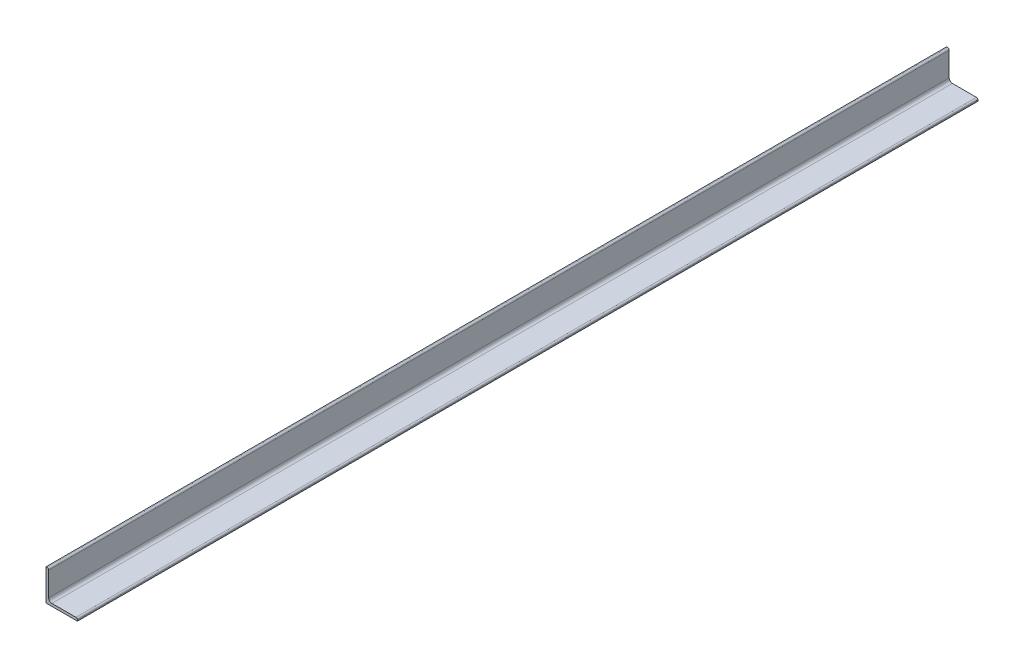
ISO-10303-21;
HEADER;
FILE_DESCRIPTION(('STEP AP214'),'2;1');
FILE_NAME('part.step','',(''),(''),'','','');
FILE_SCHEMA(('AUTOMOTIVE_DESIGN { 1 0 10303 214 1 1 1 1 }'));
ENDSEC;
DATA;
#1=APPLICATION_CONTEXT('core data for automotive mechanical design processes');
#2=APPLICATION_PROTOCOL_DEFINITION('international standard','automotive_design',2000,#1);
#3=PRODUCT_CONTEXT('',#1,'mechanical');
#4=PRODUCT('Part','Part','',(#3));
#5=PRODUCT_RELATED_PRODUCT_CATEGORY('part','',(#4));
#6=PRODUCT_DEFINITION_FORMATION('','',#4);
#7=PRODUCT_DEFINITION_CONTEXT('part definition',#1,'design');
#8=PRODUCT_DEFINITION('design','',#6,#7);
#9=PRODUCT_DEFINITION_SHAPE('','',#8);
#10=(LENGTH_UNIT() NAMED_UNIT(*) SI_UNIT(.MILLI.,.METRE.));
#11=(NAMED_UNIT(*) PLANE_ANGLE_UNIT() SI_UNIT($,.RADIAN.));
#12=(NAMED_UNIT(*) SI_UNIT($,.STERADIAN.) SOLID_ANGLE_UNIT());
#13=UNCERTAINTY_MEASURE_WITH_UNIT(LENGTH_MEASURE(1.E-05),#10,'distance_accuracy_value','');
#14=(GEOMETRIC_REPRESENTATION_CONTEXT(3) GLOBAL_UNCERTAINTY_ASSIGNED_CONTEXT((#13)) GLOBAL_UNIT_ASSIGNED_CONTEXT((#10,
#11,#12)) REPRESENTATION_CONTEXT('',''));
#15=CARTESIAN_POINT('',(0.,0.,0.));
#16=DIRECTION('',(0.,0.,1.));
#17=DIRECTION('',(1.,0.,0.));
#18=AXIS2_PLACEMENT_3D('',#15,#16,#17);
#19=CARTESIAN_POINT('',(14.224,6.35,0.));
#20=DIRECTION('',(0.,1.,0.));
#21=DIRECTION('',(0.,0.,1.));
#22=AXIS2_PLACEMENT_3D('',#19,#20,#21);
#23=PLANE('',#22);
#24=DIRECTION('',(1.,0.,0.));
#25=VECTOR('',#24,1.);
#26=CARTESIAN_POINT('',(14.224,6.35,2184.4));
#27=LINE('',#26,#25);
#28=CARTESIAN_POINT('',(14.224,6.35,2184.4));
#29=VERTEX_POINT('',#28);
#30=CARTESIAN_POINT('',(72.39,6.35000000000003,2184.4));
#31=VERTEX_POINT('',#30);
#32=EDGE_CURVE('E10',#29,#31,#27,.T.);
#33=ORIENTED_EDGE('',*,*,#32,.T.);
#34=DIRECTION('',(0.,0.,1.));
#35=VECTOR('',#34,1.);
#36=CARTESIAN_POINT('',(72.39,6.35000000000003,0.));
#37=LINE('',#36,#35);
#38=CARTESIAN_POINT('',(72.39,6.35000000000003,0.));
#39=VERTEX_POINT('',#38);
#40=EDGE_CURVE('E35',#39,#31,#37,.T.);
#41=ORIENTED_EDGE('',*,*,#40,.F.);
#42=DIRECTION('',(1.,0.,0.));
#43=VECTOR('',#42,1.);
#44=CARTESIAN_POINT('',(14.224,6.35,0.));
#45=LINE('',#44,#43);
#46=CARTESIAN_POINT('',(14.224,6.35,0.));
#47=VERTEX_POINT('',#46);
#48=EDGE_CURVE('E107',#47,#39,#45,.T.);
#49=ORIENTED_EDGE('',*,*,#48,.F.);
#50=DIRECTION('',(0.,0.,1.));
#51=VECTOR('',#50,1.);
#52=CARTESIAN_POINT('',(14.224,6.35,0.));
#53=LINE('',#52,#51);
#54=EDGE_CURVE('E26',#47,#29,#53,.T.);
#55=ORIENTED_EDGE('',*,*,#54,.T.);
#56=EDGE_LOOP('',(#33,#41,#49,#55));
#57=FACE_BOUND('',#56,.T.);
#58=ADVANCED_FACE('F16',(#57),#23,.T.);
#59=CARTESIAN_POINT('',(72.39,2.54000000000003,0.));
#60=DIRECTION('',(0.,0.,1.));
#61=DIRECTION('',(1.,0.,0.));
#62=AXIS2_PLACEMENT_3D('',#59,#60,#61);
#63=CYLINDRICAL_SURFACE('',#62,3.81);
#64=CARTESIAN_POINT('',(72.39,2.54000000000003,2184.4));
#65=DIRECTION('',(0.,0.,-1.));
#66=DIRECTION('',(0.,-1.,0.));
#67=AXIS2_PLACEMENT_3D('',#64,#65,#66);
#68=CIRCLE('',#67,3.81);
#69=CARTESIAN_POINT('',(76.2,2.54000000000003,2184.4));
#70=VERTEX_POINT('',#69);
#71=EDGE_CURVE('E115',#31,#70,#68,.T.);
#72=ORIENTED_EDGE('',*,*,#71,.T.);
#73=DIRECTION('',(0.,0.,1.));
#74=VECTOR('',#73,1.);
#75=CARTESIAN_POINT('',(76.2,2.54000000000003,0.));
#76=LINE('',#75,#74);
#77=CARTESIAN_POINT('',(76.2,2.54000000000003,0.));
#78=VERTEX_POINT('',#77);
#79=EDGE_CURVE('E117',#78,#70,#76,.T.);
#80=ORIENTED_EDGE('',*,*,#79,.F.);
#81=CARTESIAN_POINT('',(72.39,2.54000000000003,0.));
#82=DIRECTION('',(0.,0.,-1.));
#83=DIRECTION('',(0.,-1.,0.));
#84=AXIS2_PLACEMENT_3D('',#81,#82,#83);
#85=CIRCLE('',#84,3.81);
#86=EDGE_CURVE('E108',#39,#78,#85,.T.);
#87=ORIENTED_EDGE('',*,*,#86,.F.);
#88=ORIENTED_EDGE('',*,*,#40,.T.);
#89=EDGE_LOOP('',(#72,#80,#87,#88));
#90=FACE_BOUND('',#89,.T.);
#91=ADVANCED_FACE('F160',(#90),#63,.T.);
#92=CARTESIAN_POINT('',(76.2,2.54000000000003,0.));
#93=DIRECTION('',(1.,0.,0.));
#94=DIRECTION('',(0.,0.,-1.));
#95=AXIS2_PLACEMENT_3D('',#92,#93,#94);
#96=PLANE('',#95);
#97=DIRECTION('',(0.,-1.,0.));
#98=VECTOR('',#97,1.);
#99=CARTESIAN_POINT('',(76.2,2.54000000000003,2184.4));
#100=LINE('',#99,#98);
#101=CARTESIAN_POINT('',(76.2,0.,2184.4));
#102=VERTEX_POINT('',#101);
#103=EDGE_CURVE('E118',#70,#102,#100,.T.);
#104=ORIENTED_EDGE('',*,*,#103,.T.);
#105=DIRECTION('',(0.,0.,1.));
#106=VECTOR('',#105,1.);
#107=CARTESIAN_POINT('',(76.2,0.,0.));
#108=LINE('',#107,#106);
#109=CARTESIAN_POINT('',(76.2,0.,0.));
#110=VERTEX_POINT('',#109);
#111=EDGE_CURVE('E123',#110,#102,#108,.T.);
#112=ORIENTED_EDGE('',*,*,#111,.F.);
#113=DIRECTION('',(0.,-1.,0.));
#114=VECTOR('',#113,1.);
#115=CARTESIAN_POINT('',(76.2,2.54000000000003,0.));
#116=LINE('',#115,#114);
#117=EDGE_CURVE('E110',#78,#110,#116,.T.);
#118=ORIENTED_EDGE('',*,*,#117,.F.);
#119=ORIENTED_EDGE('',*,*,#79,.T.);
#120=EDGE_LOOP('',(#104,#112,#118,#119));
#121=FACE_BOUND('',#120,.T.);
#122=ADVANCED_FACE('F166',(#121),#96,.T.);
#123=CARTESIAN_POINT('',(76.2,0.,0.));
#124=DIRECTION('',(0.,-1.,0.));
#125=DIRECTION('',(0.,0.,-1.));
#126=AXIS2_PLACEMENT_3D('',#123,#124,#125);
#127=PLANE('',#126);
#128=DIRECTION('',(-1.,0.,0.));
#129=VECTOR('',#128,1.);
#130=CARTESIAN_POINT('',(76.2,0.,2184.4));
#131=LINE('',#130,#129);
#132=CARTESIAN_POINT('',(0.,0.,2184.4));
#133=VERTEX_POINT('',#132);
#134=EDGE_CURVE('E119',#102,#133,#131,.T.);
#135=ORIENTED_EDGE('',*,*,#134,.T.);
#136=DIRECTION('',(0.,0.,1.));
#137=VECTOR('',#136,1.);
#138=CARTESIAN_POINT('',(0.,0.,0.));
#139=LINE('',#138,#137);
#140=CARTESIAN_POINT('',(0.,0.,0.));
#141=VERTEX_POINT('',#140);
#142=EDGE_CURVE('E130',#141,#133,#139,.T.);
#143=ORIENTED_EDGE('',*,*,#142,.F.);
#144=DIRECTION('',(-1.,0.,0.));
#145=VECTOR('',#144,1.);
#146=CARTESIAN_POINT('',(76.2,0.,0.));
#147=LINE('',#146,#145);
#148=EDGE_CURVE('E127',#110,#141,#147,.T.);
#149=ORIENTED_EDGE('',*,*,#148,.F.);
#150=ORIENTED_EDGE('',*,*,#111,.T.);
#151=EDGE_LOOP('',(#135,#143,#149,#150));
#152=FACE_BOUND('',#151,.T.);
#153=ADVANCED_FACE('F169',(#152),#127,.T.);
#154=CARTESIAN_POINT('',(0.,0.,0.));
#155=DIRECTION('',(-1.,0.,0.));
#156=DIRECTION('',(0.,0.,1.));
#157=AXIS2_PLACEMENT_3D('',#154,#155,#156);
#158=PLANE('',#157);
#159=DIRECTION('',(0.,1.,0.));
#160=VECTOR('',#159,1.);
#161=CARTESIAN_POINT('',(0.,0.,2184.4));
#162=LINE('',#161,#160);
#163=CARTESIAN_POINT('',(0.,76.2,2184.4));
#164=VERTEX_POINT('',#163);
#165=EDGE_CURVE('E125',#133,#164,#162,.T.);
#166=ORIENTED_EDGE('',*,*,#165,.T.);
#167=DIRECTION('',(0.,0.,1.));
#168=VECTOR('',#167,1.);
#169=CARTESIAN_POINT('',(0.,76.2,0.));
#170=LINE('',#169,#168);
#171=CARTESIAN_POINT('',(0.,76.2,0.));
#172=VERTEX_POINT('',#171);
#173=EDGE_CURVE('E136',#172,#164,#170,.T.);
#174=ORIENTED_EDGE('',*,*,#173,.F.);
#175=DIRECTION('',(0.,1.,0.));
#176=VECTOR('',#175,1.);
#177=CARTESIAN_POINT('',(0.,0.,0.));
#178=LINE('',#177,#176);
#179=EDGE_CURVE('E103',#141,#172,#178,.T.);
#180=ORIENTED_EDGE('',*,*,#179,.F.);
#181=ORIENTED_EDGE('',*,*,#142,.T.);
#182=EDGE_LOOP('',(#166,#174,#180,#181));
#183=FACE_BOUND('',#182,.T.);
#184=ADVANCED_FACE('F173',(#183),#158,.T.);
#185=CARTESIAN_POINT('',(0.,76.2,0.));
#186=DIRECTION('',(0.,1.,0.));
#187=DIRECTION('',(0.,0.,1.));
#188=AXIS2_PLACEMENT_3D('',#185,#186,#187);
#189=PLANE('',#188);
#190=DIRECTION('',(1.,0.,0.));
#191=VECTOR('',#190,1.);
#192=CARTESIAN_POINT('',(0.,76.2,2184.4));
#193=LINE('',#192,#191);
#194=CARTESIAN_POINT('',(2.53999999999998,76.2,2184.4));
#195=VERTEX_POINT('',#194);
#196=EDGE_CURVE('E132',#164,#195,#193,.T.);
#197=ORIENTED_EDGE('',*,*,#196,.T.);
#198=DIRECTION('',(0.,0.,1.));
#199=VECTOR('',#198,1.);
#200=CARTESIAN_POINT('',(2.53999999999998,76.2,0.));
#201=LINE('',#200,#199);
#202=CARTESIAN_POINT('',(2.53999999999998,76.2,0.));
#203=VERTEX_POINT('',#202);
#204=EDGE_CURVE('E143',#203,#195,#201,.T.);
#205=ORIENTED_EDGE('',*,*,#204,.F.);
#206=DIRECTION('',(1.,0.,0.));
#207=VECTOR('',#206,1.);
#208=CARTESIAN_POINT('',(0.,76.2,0.));
#209=LINE('',#208,#207);
#210=EDGE_CURVE('E140',#172,#203,#209,.T.);
#211=ORIENTED_EDGE('',*,*,#210,.F.);
#212=ORIENTED_EDGE('',*,*,#173,.T.);
#213=EDGE_LOOP('',(#197,#205,#211,#212));
#214=FACE_BOUND('',#213,.T.);
#215=ADVANCED_FACE('F177',(#214),#189,.T.);
#216=CARTESIAN_POINT('',(2.53999999999998,72.39,0.));
#217=DIRECTION('',(0.,0.,1.));
#218=DIRECTION('',(1.,0.,0.));
#219=AXIS2_PLACEMENT_3D('',#216,#217,#218);
#220=CYLINDRICAL_SURFACE('',#219,3.81);
#221=CARTESIAN_POINT('',(2.53999999999998,72.39,2184.4));
#222=DIRECTION('',(0.,0.,-1.));
#223=DIRECTION('',(0.,-1.,0.));
#224=AXIS2_PLACEMENT_3D('',#221,#222,#223);
#225=CIRCLE('',#224,3.81);
#226=CARTESIAN_POINT('',(6.34999999999998,72.39,2184.4));
#227=VERTEX_POINT('',#226);
#228=EDGE_CURVE('E138',#195,#227,#225,.T.);
#229=ORIENTED_EDGE('',*,*,#228,.T.);
#230=DIRECTION('',(0.,0.,1.));
#231=VECTOR('',#230,1.);
#232=CARTESIAN_POINT('',(6.34999999999998,72.39,0.));
#233=LINE('',#232,#231);
#234=CARTESIAN_POINT('',(6.34999999999998,72.39,0.));
#235=VERTEX_POINT('',#234);
#236=EDGE_CURVE('E148',#235,#227,#233,.T.);
#237=ORIENTED_EDGE('',*,*,#236,.F.);
#238=CARTESIAN_POINT('',(2.53999999999998,72.39,0.));
#239=DIRECTION('',(0.,0.,-1.));
#240=DIRECTION('',(0.,-1.,0.));
#241=AXIS2_PLACEMENT_3D('',#238,#239,#240);
#242=CIRCLE('',#241,3.81);
#243=EDGE_CURVE('E94',#203,#235,#242,.T.);
#244=ORIENTED_EDGE('',*,*,#243,.F.);
#245=ORIENTED_EDGE('',*,*,#204,.T.);
#246=EDGE_LOOP('',(#229,#237,#244,#245));
#247=FACE_BOUND('',#246,.T.);
#248=ADVANCED_FACE('F180',(#247),#220,.T.);
#249=CARTESIAN_POINT('',(6.34999999999998,72.39,0.));
#250=DIRECTION('',(1.,0.,0.));
#251=DIRECTION('',(0.,0.,-1.));
#252=AXIS2_PLACEMENT_3D('',#249,#250,#251);
#253=PLANE('',#252);
#254=DIRECTION('',(0.,-1.,0.));
#255=VECTOR('',#254,1.);
#256=CARTESIAN_POINT('',(6.34999999999998,72.39,2184.4));
#257=LINE('',#256,#255);
#258=CARTESIAN_POINT('',(6.35,14.224,2184.4));
#259=VERTEX_POINT('',#258);
#260=EDGE_CURVE('E100',#227,#259,#257,.T.);
#261=ORIENTED_EDGE('',*,*,#260,.T.);
#262=DIRECTION('',(0.,0.,1.));
#263=VECTOR('',#262,1.);
#264=CARTESIAN_POINT('',(6.35,14.224,0.));
#265=LINE('',#264,#263);
#266=CARTESIAN_POINT('',(6.35,14.224,0.));
#267=VERTEX_POINT('',#266);
#268=EDGE_CURVE('E85',#267,#259,#265,.T.);
#269=ORIENTED_EDGE('',*,*,#268,.F.);
#270=DIRECTION('',(0.,-1.,0.));
#271=VECTOR('',#270,1.);
#272=CARTESIAN_POINT('',(6.34999999999998,72.39,0.));
#273=LINE('',#272,#271);
#274=EDGE_CURVE('E91',#235,#267,#273,.T.);
#275=ORIENTED_EDGE('',*,*,#274,.F.);
#276=ORIENTED_EDGE('',*,*,#236,.T.);
#277=EDGE_LOOP('',(#261,#269,#275,#276));
#278=FACE_BOUND('',#277,.T.);
#279=ADVANCED_FACE('F98',(#278),#253,.T.);
#280=CARTESIAN_POINT('',(14.224,14.224,0.));
#281=DIRECTION('',(0.,0.,1.));
#282=DIRECTION('',(1.,0.,0.));
#283=AXIS2_PLACEMENT_3D('',#280,#281,#282);
#284=CYLINDRICAL_SURFACE('',#283,7.874);
#285=CARTESIAN_POINT('',(14.224,14.224,2184.4));
#286=DIRECTION('',(0.,0.,1.));
#287=DIRECTION('',(1.,0.,0.));
#288=AXIS2_PLACEMENT_3D('',#285,#286,#287);
#289=CIRCLE('',#288,7.874);
#290=EDGE_CURVE('E102',#259,#29,#289,.T.);
#291=ORIENTED_EDGE('',*,*,#290,.T.);
#292=ORIENTED_EDGE('',*,*,#54,.F.);
#293=CARTESIAN_POINT('',(14.224,14.224,0.));
#294=DIRECTION('',(0.,0.,1.));
#295=DIRECTION('',(1.,0.,0.));
#296=AXIS2_PLACEMENT_3D('',#293,#294,#295);
#297=CIRCLE('',#296,7.874);
#298=EDGE_CURVE('E20',#267,#47,#297,.T.);
#299=ORIENTED_EDGE('',*,*,#298,.F.);
#300=ORIENTED_EDGE('',*,*,#268,.T.);
#301=EDGE_LOOP('',(#291,#292,#299,#300));
#302=FACE_BOUND('',#301,.T.);
#303=ADVANCED_FACE('F18',(#302),#284,.F.);
#304=CARTESIAN_POINT('',(38.1,38.1,0.));
#305=DIRECTION('',(0.,0.,1.));
#306=DIRECTION('',(1.,0.,0.));
#307=AXIS2_PLACEMENT_3D('',#304,#305,#306);
#308=PLANE('',#307);
#309=ORIENTED_EDGE('',*,*,#179,.T.);
#310=ORIENTED_EDGE('',*,*,#210,.T.);
#311=ORIENTED_EDGE('',*,*,#243,.T.);
#312=ORIENTED_EDGE('',*,*,#274,.T.);
#313=ORIENTED_EDGE('',*,*,#298,.T.);
#314=ORIENTED_EDGE('',*,*,#48,.T.);
#315=ORIENTED_EDGE('',*,*,#86,.T.);
#316=ORIENTED_EDGE('',*,*,#117,.T.);
#317=ORIENTED_EDGE('',*,*,#148,.T.);
#318=EDGE_LOOP('',(#309,#310,#311,#312,#313,#314,#315,#316,#317));
#319=FACE_BOUND('',#318,.T.);
#320=ADVANCED_FACE('F92',(#319),#308,.F.);
#321=CARTESIAN_POINT('',(38.1,38.1,2184.4));
#322=DIRECTION('',(0.,0.,1.));
#323=DIRECTION('',(1.,0.,0.));
#324=AXIS2_PLACEMENT_3D('',#321,#322,#323);
#325=PLANE('',#324);
#326=ORIENTED_EDGE('',*,*,#165,.F.);
#327=ORIENTED_EDGE('',*,*,#134,.F.);
#328=ORIENTED_EDGE('',*,*,#103,.F.);
#329=ORIENTED_EDGE('',*,*,#71,.F.);
#330=ORIENTED_EDGE('',*,*,#32,.F.);
#331=ORIENTED_EDGE('',*,*,#290,.F.);
#332=ORIENTED_EDGE('',*,*,#260,.F.);
#333=ORIENTED_EDGE('',*,*,#228,.F.);
#334=ORIENTED_EDGE('',*,*,#196,.F.);
#335=EDGE_LOOP('',(#326,#327,#328,#329,#330,#331,#332,#333,#334));
#336=FACE_BOUND('',#335,.T.);
#337=ADVANCED_FACE('F154',(#336),#325,.T.);
#338=CLOSED_SHELL('',(#58,#91,#122,#153,#184,#215,#248,#279,#303,#320,#337));
#339=MANIFOLD_SOLID_BREP('B1',#338);
#340=ADVANCED_BREP_SHAPE_REPRESENTATION('',(#18,#339),#14);
#341=SHAPE_DEFINITION_REPRESENTATION(#9,#340);
ENDSEC;
END-ISO-10303-21;
